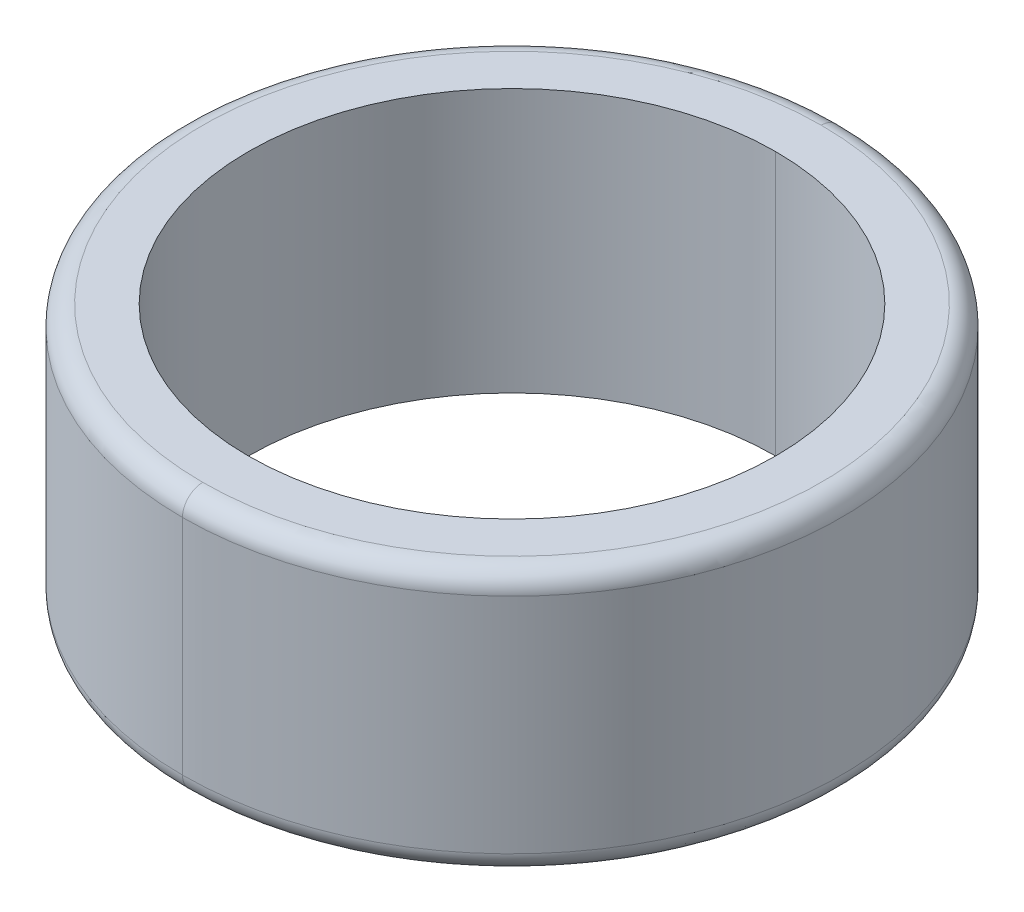
ISO-10303-21;
HEADER;
FILE_DESCRIPTION(('STEP AP214'),'2;1');
FILE_NAME('part.step','',(''),(''),'','','');
FILE_SCHEMA(('AUTOMOTIVE_DESIGN { 1 0 10303 214 1 1 1 1 }'));
ENDSEC;
DATA;
#1=APPLICATION_CONTEXT('core data for automotive mechanical design processes');
#2=APPLICATION_PROTOCOL_DEFINITION('international standard','automotive_design',2000,#1);
#3=PRODUCT_CONTEXT('',#1,'mechanical');
#4=PRODUCT('Part','Part','',(#3));
#5=PRODUCT_RELATED_PRODUCT_CATEGORY('part','',(#4));
#6=PRODUCT_DEFINITION_FORMATION('','',#4);
#7=PRODUCT_DEFINITION_CONTEXT('part definition',#1,'design');
#8=PRODUCT_DEFINITION('design','',#6,#7);
#9=PRODUCT_DEFINITION_SHAPE('','',#8);
#10=(LENGTH_UNIT() NAMED_UNIT(*) SI_UNIT(.MILLI.,.METRE.));
#11=(NAMED_UNIT(*) PLANE_ANGLE_UNIT() SI_UNIT($,.RADIAN.));
#12=(NAMED_UNIT(*) SI_UNIT($,.STERADIAN.) SOLID_ANGLE_UNIT());
#13=UNCERTAINTY_MEASURE_WITH_UNIT(LENGTH_MEASURE(1.E-05),#10,'distance_accuracy_value','');
#14=(GEOMETRIC_REPRESENTATION_CONTEXT(3) GLOBAL_UNCERTAINTY_ASSIGNED_CONTEXT((#13)) GLOBAL_UNIT_ASSIGNED_CONTEXT((#10,
#11,#12)) REPRESENTATION_CONTEXT('',''));
#15=CARTESIAN_POINT('',(0.,0.,0.));
#16=DIRECTION('',(0.,0.,1.));
#17=DIRECTION('',(1.,0.,0.));
#18=AXIS2_PLACEMENT_3D('',#15,#16,#17);
#19=CARTESIAN_POINT('',(0.,24.,0.));
#20=DIRECTION('',(0.,1.,0.));
#21=DIRECTION('',(0.,0.,1.));
#22=AXIS2_PLACEMENT_3D('',#19,#20,#21);
#23=TOROIDAL_SURFACE('',#22,30.5,2.);
#24=CARTESIAN_POINT('',(0.,24.,-30.5));
#25=DIRECTION('',(1.,0.,0.));
#26=DIRECTION('',(0.,0.,-1.));
#27=AXIS2_PLACEMENT_3D('',#24,#25,#26);
#28=CIRCLE('',#27,2.);
#29=CARTESIAN_POINT('',(0.,24.,-32.5));
#30=VERTEX_POINT('',#29);
#31=CARTESIAN_POINT('',(0.,26.,-30.5));
#32=VERTEX_POINT('',#31);
#33=EDGE_CURVE('E131',#30,#32,#28,.T.);
#34=ORIENTED_EDGE('',*,*,#33,.F.);
#35=CARTESIAN_POINT('',(0.,24.,0.));
#36=DIRECTION('',(0.,-1.,0.));
#37=DIRECTION('',(0.,0.,1.));
#38=AXIS2_PLACEMENT_3D('',#35,#36,#37);
#39=CIRCLE('',#38,32.5);
#40=CARTESIAN_POINT('',(0.,24.,32.5));
#41=VERTEX_POINT('',#40);
#42=EDGE_CURVE('E129',#41,#30,#39,.T.);
#43=ORIENTED_EDGE('',*,*,#42,.F.);
#44=CARTESIAN_POINT('',(0.,24.,30.5));
#45=DIRECTION('',(-1.,0.,0.));
#46=DIRECTION('',(0.,0.,1.));
#47=AXIS2_PLACEMENT_3D('',#44,#45,#46);
#48=CIRCLE('',#47,2.);
#49=CARTESIAN_POINT('',(0.,26.,30.5));
#50=VERTEX_POINT('',#49);
#51=EDGE_CURVE('E117',#41,#50,#48,.T.);
#52=ORIENTED_EDGE('',*,*,#51,.T.);
#53=CARTESIAN_POINT('',(0.,26.,0.));
#54=DIRECTION('',(0.,1.,0.));
#55=DIRECTION('',(0.,0.,1.));
#56=AXIS2_PLACEMENT_3D('',#53,#54,#55);
#57=CIRCLE('',#56,30.5);
#58=EDGE_CURVE('E179',#32,#50,#57,.T.);
#59=ORIENTED_EDGE('',*,*,#58,.F.);
#60=EDGE_LOOP('',(#34,#43,#52,#59));
#61=FACE_BOUND('',#60,.T.);
#62=ADVANCED_FACE('F16',(#61),#23,.T.);
#63=CARTESIAN_POINT('',(0.,2.,0.));
#64=DIRECTION('',(0.,1.,0.));
#65=DIRECTION('',(0.,0.,1.));
#66=AXIS2_PLACEMENT_3D('',#63,#64,#65);
#67=TOROIDAL_SURFACE('',#66,30.5,2.);
#68=CARTESIAN_POINT('',(0.,2.,-30.5));
#69=DIRECTION('',(1.,0.,0.));
#70=DIRECTION('',(0.,0.,-1.));
#71=AXIS2_PLACEMENT_3D('',#68,#69,#70);
#72=CIRCLE('',#71,2.);
#73=CARTESIAN_POINT('',(0.,0.,-30.5));
#74=VERTEX_POINT('',#73);
#75=CARTESIAN_POINT('',(0.,2.,-32.5));
#76=VERTEX_POINT('',#75);
#77=EDGE_CURVE('E109',#74,#76,#72,.T.);
#78=ORIENTED_EDGE('',*,*,#77,.F.);
#79=CARTESIAN_POINT('',(0.,0.,0.));
#80=DIRECTION('',(0.,-1.,0.));
#81=DIRECTION('',(0.,0.,1.));
#82=AXIS2_PLACEMENT_3D('',#79,#80,#81);
#83=CIRCLE('',#82,30.5);
#84=CARTESIAN_POINT('',(0.,0.,30.5));
#85=VERTEX_POINT('',#84);
#86=EDGE_CURVE('E27',#85,#74,#83,.T.);
#87=ORIENTED_EDGE('',*,*,#86,.F.);
#88=CARTESIAN_POINT('',(0.,2.,30.5));
#89=DIRECTION('',(-1.,0.,0.));
#90=DIRECTION('',(0.,0.,1.));
#91=AXIS2_PLACEMENT_3D('',#88,#89,#90);
#92=CIRCLE('',#91,2.);
#93=CARTESIAN_POINT('',(0.,2.,32.5));
#94=VERTEX_POINT('',#93);
#95=EDGE_CURVE('E115',#85,#94,#92,.T.);
#96=ORIENTED_EDGE('',*,*,#95,.T.);
#97=CARTESIAN_POINT('',(0.,2.,0.));
#98=DIRECTION('',(0.,1.,0.));
#99=DIRECTION('',(0.,0.,1.));
#100=AXIS2_PLACEMENT_3D('',#97,#98,#99);
#101=CIRCLE('',#100,32.5);
#102=EDGE_CURVE('E75',#76,#94,#101,.T.);
#103=ORIENTED_EDGE('',*,*,#102,.F.);
#104=EDGE_LOOP('',(#78,#87,#96,#103));
#105=FACE_BOUND('',#104,.T.);
#106=ADVANCED_FACE('F110',(#105),#67,.T.);
#107=CARTESIAN_POINT('',(0.,0.,0.));
#108=DIRECTION('',(0.,1.,0.));
#109=DIRECTION('',(0.,0.,1.));
#110=AXIS2_PLACEMENT_3D('',#107,#108,#109);
#111=CYLINDRICAL_SURFACE('',#110,26.);
#112=DIRECTION('',(0.,1.,0.));
#113=VECTOR('',#112,1.);
#114=CARTESIAN_POINT('',(0.,0.,-26.));
#115=LINE('',#114,#113);
#116=CARTESIAN_POINT('',(0.,0.,-26.));
#117=VERTEX_POINT('',#116);
#118=CARTESIAN_POINT('',(0.,26.,-26.));
#119=VERTEX_POINT('',#118);
#120=EDGE_CURVE('E139',#117,#119,#115,.T.);
#121=ORIENTED_EDGE('',*,*,#120,.F.);
#122=CARTESIAN_POINT('',(0.,0.,0.));
#123=DIRECTION('',(0.,1.,0.));
#124=DIRECTION('',(0.,0.,1.));
#125=AXIS2_PLACEMENT_3D('',#122,#123,#124);
#126=CIRCLE('',#125,26.);
#127=CARTESIAN_POINT('',(0.,0.,26.));
#128=VERTEX_POINT('',#127);
#129=EDGE_CURVE('E10',#128,#117,#126,.T.);
#130=ORIENTED_EDGE('',*,*,#129,.F.);
#131=DIRECTION('',(0.,1.,0.));
#132=VECTOR('',#131,1.);
#133=CARTESIAN_POINT('',(0.,0.,26.));
#134=LINE('',#133,#132);
#135=CARTESIAN_POINT('',(0.,26.,26.));
#136=VERTEX_POINT('',#135);
#137=EDGE_CURVE('E135',#128,#136,#134,.T.);
#138=ORIENTED_EDGE('',*,*,#137,.T.);
#139=CARTESIAN_POINT('',(0.,26.,0.));
#140=DIRECTION('',(0.,1.,0.));
#141=DIRECTION('',(0.,0.,1.));
#142=AXIS2_PLACEMENT_3D('',#139,#140,#141);
#143=CIRCLE('',#142,26.);
#144=EDGE_CURVE('E41',#136,#119,#143,.T.);
#145=ORIENTED_EDGE('',*,*,#144,.T.);
#146=EDGE_LOOP('',(#121,#130,#138,#145));
#147=FACE_BOUND('',#146,.T.);
#148=ADVANCED_FACE('F269',(#147),#111,.F.);
#149=CARTESIAN_POINT('',(0.,0.,0.));
#150=DIRECTION('',(0.,1.,0.));
#151=DIRECTION('',(1.,0.,0.));
#152=AXIS2_PLACEMENT_3D('',#149,#150,#151);
#153=PLANE('',#152);
#154=ORIENTED_EDGE('',*,*,#129,.T.);
#155=CARTESIAN_POINT('',(0.,0.,0.));
#156=DIRECTION('',(0.,1.,0.));
#157=DIRECTION('',(0.,0.,1.));
#158=AXIS2_PLACEMENT_3D('',#155,#156,#157);
#159=CIRCLE('',#158,26.);
#160=EDGE_CURVE('E142',#117,#128,#159,.T.);
#161=ORIENTED_EDGE('',*,*,#160,.T.);
#162=EDGE_LOOP('',(#154,#161));
#163=FACE_BOUND('',#162,.T.);
#164=ORIENTED_EDGE('',*,*,#86,.T.);
#165=CARTESIAN_POINT('',(0.,0.,0.));
#166=DIRECTION('',(0.,-1.,0.));
#167=DIRECTION('',(0.,0.,1.));
#168=AXIS2_PLACEMENT_3D('',#165,#166,#167);
#169=CIRCLE('',#168,30.5);
#170=EDGE_CURVE('E104',#74,#85,#169,.T.);
#171=ORIENTED_EDGE('',*,*,#170,.T.);
#172=EDGE_LOOP('',(#164,#171));
#173=FACE_BOUND('',#172,.T.);
#174=ADVANCED_FACE('F102',(#163,#173),#153,.F.);
#175=CARTESIAN_POINT('',(0.,26.,0.));
#176=DIRECTION('',(0.,1.,0.));
#177=DIRECTION('',(1.,0.,0.));
#178=AXIS2_PLACEMENT_3D('',#175,#176,#177);
#179=PLANE('',#178);
#180=ORIENTED_EDGE('',*,*,#144,.F.);
#181=CARTESIAN_POINT('',(0.,26.,0.));
#182=DIRECTION('',(0.,1.,0.));
#183=DIRECTION('',(0.,0.,1.));
#184=AXIS2_PLACEMENT_3D('',#181,#182,#183);
#185=CIRCLE('',#184,26.);
#186=EDGE_CURVE('E20',#119,#136,#185,.T.);
#187=ORIENTED_EDGE('',*,*,#186,.F.);
#188=EDGE_LOOP('',(#180,#187));
#189=FACE_BOUND('',#188,.T.);
#190=CARTESIAN_POINT('',(0.,26.,0.));
#191=DIRECTION('',(0.,1.,0.));
#192=DIRECTION('',(0.,0.,1.));
#193=AXIS2_PLACEMENT_3D('',#190,#191,#192);
#194=CIRCLE('',#193,30.5);
#195=EDGE_CURVE('E125',#50,#32,#194,.T.);
#196=ORIENTED_EDGE('',*,*,#195,.T.);
#197=ORIENTED_EDGE('',*,*,#58,.T.);
#198=EDGE_LOOP('',(#196,#197));
#199=FACE_BOUND('',#198,.T.);
#200=ADVANCED_FACE('F246',(#189,#199),#179,.T.);
#201=CARTESIAN_POINT('',(0.,26.,0.));
#202=DIRECTION('',(0.,-1.,0.));
#203=DIRECTION('',(0.,0.,-1.));
#204=AXIS2_PLACEMENT_3D('',#201,#202,#203);
#205=CYLINDRICAL_SURFACE('',#204,32.5);
#206=DIRECTION('',(0.,-1.,0.));
#207=VECTOR('',#206,1.);
#208=CARTESIAN_POINT('',(0.,26.,32.5));
#209=LINE('',#208,#207);
#210=EDGE_CURVE('E138',#41,#94,#209,.T.);
#211=ORIENTED_EDGE('',*,*,#210,.F.);
#212=ORIENTED_EDGE('',*,*,#42,.T.);
#213=DIRECTION('',(0.,-1.,0.));
#214=VECTOR('',#213,1.);
#215=CARTESIAN_POINT('',(0.,26.,-32.5));
#216=LINE('',#215,#214);
#217=EDGE_CURVE('E159',#30,#76,#216,.T.);
#218=ORIENTED_EDGE('',*,*,#217,.T.);
#219=ORIENTED_EDGE('',*,*,#102,.T.);
#220=EDGE_LOOP('',(#211,#212,#218,#219));
#221=FACE_BOUND('',#220,.T.);
#222=ADVANCED_FACE('F173',(#221),#205,.T.);
#223=CARTESIAN_POINT('',(0.,26.,0.));
#224=DIRECTION('',(0.,-1.,0.));
#225=DIRECTION('',(0.,0.,-1.));
#226=AXIS2_PLACEMENT_3D('',#223,#224,#225);
#227=CYLINDRICAL_SURFACE('',#226,32.5);
#228=CARTESIAN_POINT('',(0.,24.,0.));
#229=DIRECTION('',(0.,-1.,0.));
#230=DIRECTION('',(0.,0.,1.));
#231=AXIS2_PLACEMENT_3D('',#228,#229,#230);
#232=CIRCLE('',#231,32.5);
#233=EDGE_CURVE('E134',#30,#41,#232,.T.);
#234=ORIENTED_EDGE('',*,*,#233,.T.);
#235=ORIENTED_EDGE('',*,*,#210,.T.);
#236=CARTESIAN_POINT('',(0.,2.,0.));
#237=DIRECTION('',(0.,1.,0.));
#238=DIRECTION('',(0.,0.,1.));
#239=AXIS2_PLACEMENT_3D('',#236,#237,#238);
#240=CIRCLE('',#239,32.5);
#241=EDGE_CURVE('E114',#94,#76,#240,.T.);
#242=ORIENTED_EDGE('',*,*,#241,.T.);
#243=ORIENTED_EDGE('',*,*,#217,.F.);
#244=EDGE_LOOP('',(#234,#235,#242,#243));
#245=FACE_BOUND('',#244,.T.);
#246=ADVANCED_FACE('F169',(#245),#227,.T.);
#247=CARTESIAN_POINT('',(0.,0.,0.));
#248=DIRECTION('',(0.,1.,0.));
#249=DIRECTION('',(0.,0.,1.));
#250=AXIS2_PLACEMENT_3D('',#247,#248,#249);
#251=CYLINDRICAL_SURFACE('',#250,26.);
#252=ORIENTED_EDGE('',*,*,#160,.F.);
#253=ORIENTED_EDGE('',*,*,#120,.T.);
#254=ORIENTED_EDGE('',*,*,#186,.T.);
#255=ORIENTED_EDGE('',*,*,#137,.F.);
#256=EDGE_LOOP('',(#252,#253,#254,#255));
#257=FACE_BOUND('',#256,.T.);
#258=ADVANCED_FACE('F257',(#257),#251,.F.);
#259=CARTESIAN_POINT('',(0.,2.,0.));
#260=DIRECTION('',(0.,1.,0.));
#261=DIRECTION('',(0.,0.,1.));
#262=AXIS2_PLACEMENT_3D('',#259,#260,#261);
#263=TOROIDAL_SURFACE('',#262,30.5,2.);
#264=ORIENTED_EDGE('',*,*,#170,.F.);
#265=ORIENTED_EDGE('',*,*,#77,.T.);
#266=ORIENTED_EDGE('',*,*,#241,.F.);
#267=ORIENTED_EDGE('',*,*,#95,.F.);
#268=EDGE_LOOP('',(#264,#265,#266,#267));
#269=FACE_BOUND('',#268,.T.);
#270=ADVANCED_FACE('F18',(#269),#263,.T.);
#271=CARTESIAN_POINT('',(0.,24.,0.));
#272=DIRECTION('',(0.,1.,0.));
#273=DIRECTION('',(0.,0.,1.));
#274=AXIS2_PLACEMENT_3D('',#271,#272,#273);
#275=TOROIDAL_SURFACE('',#274,30.5,2.);
#276=ORIENTED_EDGE('',*,*,#233,.F.);
#277=ORIENTED_EDGE('',*,*,#33,.T.);
#278=ORIENTED_EDGE('',*,*,#195,.F.);
#279=ORIENTED_EDGE('',*,*,#51,.F.);
#280=EDGE_LOOP('',(#276,#277,#278,#279));
#281=FACE_BOUND('',#280,.T.);
#282=ADVANCED_FACE('F176',(#281),#275,.T.);
#283=CLOSED_SHELL('',(#62,#106,#148,#174,#200,#222,#246,#258,#270,#282));
#284=MANIFOLD_SOLID_BREP('B1',#283);
#285=ADVANCED_BREP_SHAPE_REPRESENTATION('',(#18,#284),#14);
#286=SHAPE_DEFINITION_REPRESENTATION(#9,#285);
ENDSEC;
END-ISO-10303-21;
